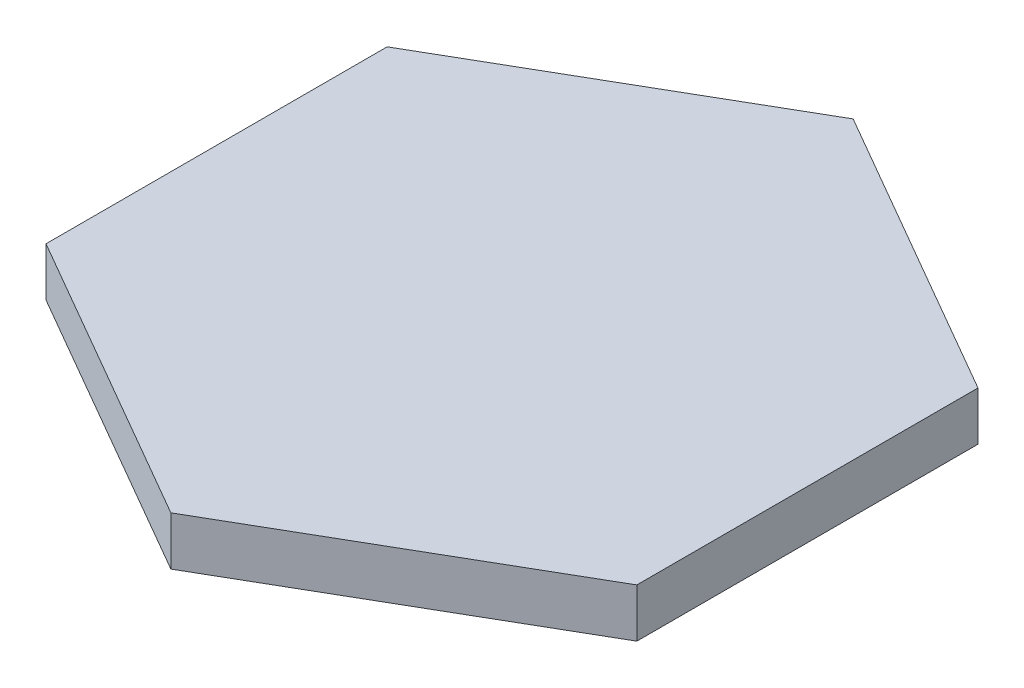
ISO-10303-21;
HEADER;
FILE_DESCRIPTION(('STEP AP214'),'2;1');
FILE_NAME('part.step','',(''),(''),'','','');
FILE_SCHEMA(('AUTOMOTIVE_DESIGN { 1 0 10303 214 1 1 1 1 }'));
ENDSEC;
DATA;
#1=APPLICATION_CONTEXT('core data for automotive mechanical design processes');
#2=APPLICATION_PROTOCOL_DEFINITION('international standard','automotive_design',2000,#1);
#3=PRODUCT_CONTEXT('',#1,'mechanical');
#4=PRODUCT('Part','Part','',(#3));
#5=PRODUCT_RELATED_PRODUCT_CATEGORY('part','',(#4));
#6=PRODUCT_DEFINITION_FORMATION('','',#4);
#7=PRODUCT_DEFINITION_CONTEXT('part definition',#1,'design');
#8=PRODUCT_DEFINITION('design','',#6,#7);
#9=PRODUCT_DEFINITION_SHAPE('','',#8);
#10=(LENGTH_UNIT() NAMED_UNIT(*) SI_UNIT(.MILLI.,.METRE.));
#11=(NAMED_UNIT(*) PLANE_ANGLE_UNIT() SI_UNIT($,.RADIAN.));
#12=(NAMED_UNIT(*) SI_UNIT($,.STERADIAN.) SOLID_ANGLE_UNIT());
#13=UNCERTAINTY_MEASURE_WITH_UNIT(LENGTH_MEASURE(1.E-05),#10,'distance_accuracy_value','');
#14=(GEOMETRIC_REPRESENTATION_CONTEXT(3) GLOBAL_UNCERTAINTY_ASSIGNED_CONTEXT((#13)) GLOBAL_UNIT_ASSIGNED_CONTEXT((#10,
#11,#12)) REPRESENTATION_CONTEXT('',''));
#15=CARTESIAN_POINT('',(0.,0.,0.));
#16=DIRECTION('',(0.,0.,1.));
#17=DIRECTION('',(1.,0.,0.));
#18=AXIS2_PLACEMENT_3D('',#15,#16,#17);
#19=CARTESIAN_POINT('',(76.9896583964361,12.7,-44.4500000000009));
#20=DIRECTION('',(-0.499999999999995,0.,0.866025403784442));
#21=DIRECTION('',(0.866025403784442,0.,0.499999999999995));
#22=AXIS2_PLACEMENT_3D('',#19,#20,#21);
#23=PLANE('',#22);
#24=DIRECTION('',(-0.866025403784442,0.,-0.499999999999995));
#25=VECTOR('',#24,1.);
#26=CARTESIAN_POINT('',(76.9896583964361,0.,-44.4500000000009));
#27=LINE('',#26,#25);
#28=CARTESIAN_POINT('',(76.9896583964361,0.,-44.4500000000009));
#29=VERTEX_POINT('',#28);
#30=CARTESIAN_POINT('',(0.,0.,-88.9));
#31=VERTEX_POINT('',#30);
#32=EDGE_CURVE('E121',#29,#31,#27,.T.);
#33=ORIENTED_EDGE('',*,*,#32,.T.);
#34=DIRECTION('',(0.,-1.,0.));
#35=VECTOR('',#34,1.);
#36=CARTESIAN_POINT('',(0.,12.7,-88.9));
#37=LINE('',#36,#35);
#38=CARTESIAN_POINT('',(0.,12.7,-88.9));
#39=VERTEX_POINT('',#38);
#40=EDGE_CURVE('E11',#39,#31,#37,.T.);
#41=ORIENTED_EDGE('',*,*,#40,.F.);
#42=DIRECTION('',(-0.866025403784442,0.,-0.499999999999995));
#43=VECTOR('',#42,1.);
#44=CARTESIAN_POINT('',(76.9896583964361,12.7,-44.4500000000009));
#45=LINE('',#44,#43);
#46=CARTESIAN_POINT('',(76.9896583964361,12.7,-44.4500000000009));
#47=VERTEX_POINT('',#46);
#48=EDGE_CURVE('E131',#47,#39,#45,.T.);
#49=ORIENTED_EDGE('',*,*,#48,.F.);
#50=DIRECTION('',(0.,-1.,0.));
#51=VECTOR('',#50,1.);
#52=CARTESIAN_POINT('',(76.9896583964361,12.7,-44.4500000000009));
#53=LINE('',#52,#51);
#54=EDGE_CURVE('E117',#47,#29,#53,.T.);
#55=ORIENTED_EDGE('',*,*,#54,.T.);
#56=EDGE_LOOP('',(#33,#41,#49,#55));
#57=FACE_BOUND('',#56,.T.);
#58=ADVANCED_FACE('F37',(#57),#23,.F.);
#59=CARTESIAN_POINT('',(0.,12.7,-88.9));
#60=DIRECTION('',(0.500000000000001,0.,0.866025403784438));
#61=DIRECTION('',(0.866025403784438,0.,-0.500000000000001));
#62=AXIS2_PLACEMENT_3D('',#59,#60,#61);
#63=PLANE('',#62);
#64=DIRECTION('',(-0.866025403784438,0.,0.500000000000001));
#65=VECTOR('',#64,1.);
#66=CARTESIAN_POINT('',(0.,0.,-88.9));
#67=LINE('',#66,#65);
#68=CARTESIAN_POINT('',(-76.9896583964367,0.,-44.4499999999998));
#69=VERTEX_POINT('',#68);
#70=EDGE_CURVE('E124',#31,#69,#67,.T.);
#71=ORIENTED_EDGE('',*,*,#70,.T.);
#72=DIRECTION('',(0.,-1.,0.));
#73=VECTOR('',#72,1.);
#74=CARTESIAN_POINT('',(-76.9896583964367,12.7,-44.4499999999998));
#75=LINE('',#74,#73);
#76=CARTESIAN_POINT('',(-76.9896583964367,12.7,-44.4499999999998));
#77=VERTEX_POINT('',#76);
#78=EDGE_CURVE('E45',#77,#69,#75,.T.);
#79=ORIENTED_EDGE('',*,*,#78,.F.);
#80=DIRECTION('',(-0.866025403784438,0.,0.500000000000001));
#81=VECTOR('',#80,1.);
#82=CARTESIAN_POINT('',(0.,12.7,-88.9));
#83=LINE('',#82,#81);
#84=EDGE_CURVE('E90',#39,#77,#83,.T.);
#85=ORIENTED_EDGE('',*,*,#84,.F.);
#86=ORIENTED_EDGE('',*,*,#40,.T.);
#87=EDGE_LOOP('',(#71,#79,#85,#86));
#88=FACE_BOUND('',#87,.T.);
#89=ADVANCED_FACE('F155',(#88),#63,.F.);
#90=CARTESIAN_POINT('',(-76.9896583964367,12.7,-44.4499999999998));
#91=DIRECTION('',(1.,0.,0.));
#92=DIRECTION('',(0.,0.,-1.));
#93=AXIS2_PLACEMENT_3D('',#90,#91,#92);
#94=PLANE('',#93);
#95=DIRECTION('',(0.,0.,1.));
#96=VECTOR('',#95,1.);
#97=CARTESIAN_POINT('',(-76.9896583964367,0.,-44.4499999999998));
#98=LINE('',#97,#96);
#99=CARTESIAN_POINT('',(-76.9896583964364,0.,44.4500000000004));
#100=VERTEX_POINT('',#99);
#101=EDGE_CURVE('E126',#69,#100,#98,.T.);
#102=ORIENTED_EDGE('',*,*,#101,.T.);
#103=DIRECTION('',(0.,-1.,0.));
#104=VECTOR('',#103,1.);
#105=CARTESIAN_POINT('',(-76.9896583964364,12.7,44.4500000000004));
#106=LINE('',#105,#104);
#107=CARTESIAN_POINT('',(-76.9896583964364,12.7,44.4500000000004));
#108=VERTEX_POINT('',#107);
#109=EDGE_CURVE('E112',#108,#100,#106,.T.);
#110=ORIENTED_EDGE('',*,*,#109,.F.);
#111=DIRECTION('',(0.,0.,1.));
#112=VECTOR('',#111,1.);
#113=CARTESIAN_POINT('',(-76.9896583964367,12.7,-44.4499999999998));
#114=LINE('',#113,#112);
#115=EDGE_CURVE('E103',#77,#108,#114,.T.);
#116=ORIENTED_EDGE('',*,*,#115,.F.);
#117=ORIENTED_EDGE('',*,*,#78,.T.);
#118=EDGE_LOOP('',(#102,#110,#116,#117));
#119=FACE_BOUND('',#118,.T.);
#120=ADVANCED_FACE('F137',(#119),#94,.F.);
#121=CARTESIAN_POINT('',(-76.9896583964364,12.7,44.4500000000004));
#122=DIRECTION('',(0.499999999999995,0.,-0.866025403784442));
#123=DIRECTION('',(-0.866025403784442,0.,-0.499999999999995));
#124=AXIS2_PLACEMENT_3D('',#121,#122,#123);
#125=PLANE('',#124);
#126=DIRECTION('',(0.866025403784442,0.,0.499999999999995));
#127=VECTOR('',#126,1.);
#128=CARTESIAN_POINT('',(-76.9896583964364,0.,44.4500000000004));
#129=LINE('',#128,#127);
#130=CARTESIAN_POINT('',(6.20785382046309E-13,0.,88.9));
#131=VERTEX_POINT('',#130);
#132=EDGE_CURVE('E111',#100,#131,#129,.T.);
#133=ORIENTED_EDGE('',*,*,#132,.T.);
#134=DIRECTION('',(0.,-1.,0.));
#135=VECTOR('',#134,1.);
#136=CARTESIAN_POINT('',(6.20785382046309E-13,12.7,88.9));
#137=LINE('',#136,#135);
#138=CARTESIAN_POINT('',(6.20785382046309E-13,12.7,88.9));
#139=VERTEX_POINT('',#138);
#140=EDGE_CURVE('E108',#139,#131,#137,.T.);
#141=ORIENTED_EDGE('',*,*,#140,.F.);
#142=DIRECTION('',(0.866025403784442,0.,0.499999999999995));
#143=VECTOR('',#142,1.);
#144=CARTESIAN_POINT('',(-76.9896583964364,12.7,44.4500000000004));
#145=LINE('',#144,#143);
#146=EDGE_CURVE('E97',#108,#139,#145,.T.);
#147=ORIENTED_EDGE('',*,*,#146,.F.);
#148=ORIENTED_EDGE('',*,*,#109,.T.);
#149=EDGE_LOOP('',(#133,#141,#147,#148));
#150=FACE_BOUND('',#149,.T.);
#151=ADVANCED_FACE('F109',(#150),#125,.F.);
#152=CARTESIAN_POINT('',(6.20785382046309E-13,12.7,88.9));
#153=DIRECTION('',(-0.500000000000007,0.,-0.866025403784435));
#154=DIRECTION('',(-0.866025403784435,0.,0.500000000000007));
#155=AXIS2_PLACEMENT_3D('',#152,#153,#154);
#156=PLANE('',#155);
#157=DIRECTION('',(0.866025403784434,0.,-0.500000000000007));
#158=VECTOR('',#157,1.);
#159=CARTESIAN_POINT('',(6.20785382046309E-13,0.,88.9));
#160=LINE('',#159,#158);
#161=CARTESIAN_POINT('',(76.989658396437,0.,44.4499999999993));
#162=VERTEX_POINT('',#161);
#163=EDGE_CURVE('E76',#131,#162,#160,.T.);
#164=ORIENTED_EDGE('',*,*,#163,.T.);
#165=DIRECTION('',(0.,-1.,0.));
#166=VECTOR('',#165,1.);
#167=CARTESIAN_POINT('',(76.989658396437,12.7,44.4499999999993));
#168=LINE('',#167,#166);
#169=CARTESIAN_POINT('',(76.989658396437,12.7,44.4499999999993));
#170=VERTEX_POINT('',#169);
#171=EDGE_CURVE('E113',#170,#162,#168,.T.);
#172=ORIENTED_EDGE('',*,*,#171,.F.);
#173=DIRECTION('',(0.866025403784434,0.,-0.500000000000007));
#174=VECTOR('',#173,1.);
#175=CARTESIAN_POINT('',(6.20785382046309E-13,12.7,88.9));
#176=LINE('',#175,#174);
#177=EDGE_CURVE('E101',#139,#170,#176,.T.);
#178=ORIENTED_EDGE('',*,*,#177,.F.);
#179=ORIENTED_EDGE('',*,*,#140,.T.);
#180=EDGE_LOOP('',(#164,#172,#178,#179));
#181=FACE_BOUND('',#180,.T.);
#182=ADVANCED_FACE('F115',(#181),#156,.F.);
#183=CARTESIAN_POINT('',(76.989658396437,12.7,44.4499999999993));
#184=DIRECTION('',(-1.,0.,0.));
#185=DIRECTION('',(0.,0.,1.));
#186=AXIS2_PLACEMENT_3D('',#183,#184,#185);
#187=PLANE('',#186);
#188=DIRECTION('',(0.,0.,-1.));
#189=VECTOR('',#188,1.);
#190=CARTESIAN_POINT('',(76.989658396437,0.,44.4499999999993));
#191=LINE('',#190,#189);
#192=EDGE_CURVE('E82',#162,#29,#191,.T.);
#193=ORIENTED_EDGE('',*,*,#192,.T.);
#194=ORIENTED_EDGE('',*,*,#54,.F.);
#195=DIRECTION('',(0.,0.,-1.));
#196=VECTOR('',#195,1.);
#197=CARTESIAN_POINT('',(76.989658396437,12.7,44.4499999999993));
#198=LINE('',#197,#196);
#199=EDGE_CURVE('E53',#170,#47,#198,.T.);
#200=ORIENTED_EDGE('',*,*,#199,.F.);
#201=ORIENTED_EDGE('',*,*,#171,.T.);
#202=EDGE_LOOP('',(#193,#194,#200,#201));
#203=FACE_BOUND('',#202,.T.);
#204=ADVANCED_FACE('F144',(#203),#187,.F.);
#205=CARTESIAN_POINT('',(0.,12.7,0.));
#206=DIRECTION('',(0.,1.,0.));
#207=DIRECTION('',(0.,0.,1.));
#208=AXIS2_PLACEMENT_3D('',#205,#206,#207);
#209=PLANE('',#208);
#210=ORIENTED_EDGE('',*,*,#48,.T.);
#211=ORIENTED_EDGE('',*,*,#84,.T.);
#212=ORIENTED_EDGE('',*,*,#115,.T.);
#213=ORIENTED_EDGE('',*,*,#146,.T.);
#214=ORIENTED_EDGE('',*,*,#177,.T.);
#215=ORIENTED_EDGE('',*,*,#199,.T.);
#216=EDGE_LOOP('',(#210,#211,#212,#213,#214,#215));
#217=FACE_BOUND('',#216,.T.);
#218=ADVANCED_FACE('F99',(#217),#209,.T.);
#219=CARTESIAN_POINT('',(0.,0.,0.));
#220=DIRECTION('',(0.,1.,0.));
#221=DIRECTION('',(0.,0.,1.));
#222=AXIS2_PLACEMENT_3D('',#219,#220,#221);
#223=PLANE('',#222);
#224=ORIENTED_EDGE('',*,*,#32,.F.);
#225=ORIENTED_EDGE('',*,*,#192,.F.);
#226=ORIENTED_EDGE('',*,*,#163,.F.);
#227=ORIENTED_EDGE('',*,*,#132,.F.);
#228=ORIENTED_EDGE('',*,*,#101,.F.);
#229=ORIENTED_EDGE('',*,*,#70,.F.);
#230=EDGE_LOOP('',(#224,#225,#226,#227,#228,#229));
#231=FACE_BOUND('',#230,.T.);
#232=ADVANCED_FACE('F140',(#231),#223,.F.);
#233=CLOSED_SHELL('',(#58,#89,#120,#151,#182,#204,#218,#232));
#234=MANIFOLD_SOLID_BREP('B2',#233);
#235=ADVANCED_BREP_SHAPE_REPRESENTATION('',(#18,#234),#14);
#236=SHAPE_DEFINITION_REPRESENTATION(#9,#235);
ENDSEC;
END-ISO-10303-21;
